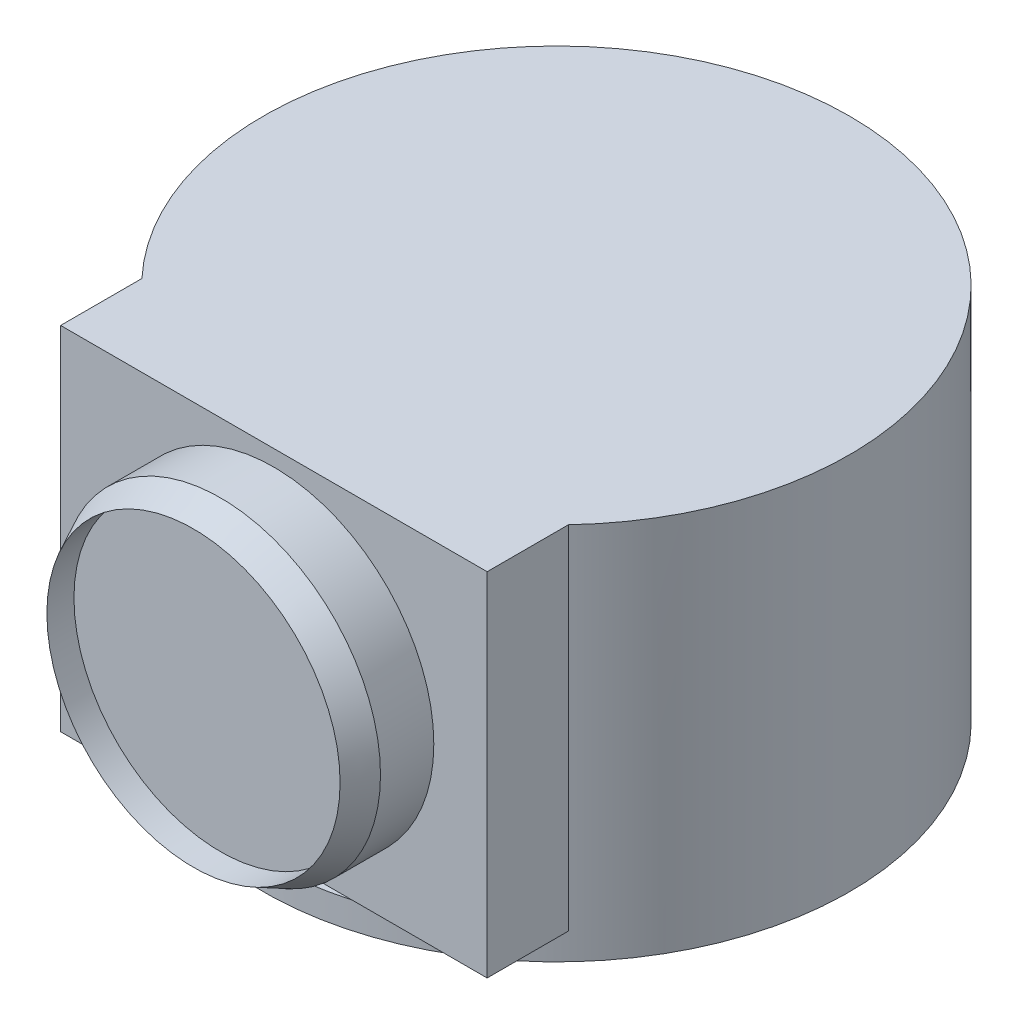
ISO-10303-21;
HEADER;
FILE_DESCRIPTION(('STEP AP214'),'2;1');
FILE_NAME('part.step','',(''),(''),'','','');
FILE_SCHEMA(('AUTOMOTIVE_DESIGN { 1 0 10303 214 1 1 1 1 }'));
ENDSEC;
DATA;
#1=APPLICATION_CONTEXT('core data for automotive mechanical design processes');
#2=APPLICATION_PROTOCOL_DEFINITION('international standard','automotive_design',2000,#1);
#3=PRODUCT_CONTEXT('',#1,'mechanical');
#4=PRODUCT('Part','Part','',(#3));
#5=PRODUCT_RELATED_PRODUCT_CATEGORY('part','',(#4));
#6=PRODUCT_DEFINITION_FORMATION('','',#4);
#7=PRODUCT_DEFINITION_CONTEXT('part definition',#1,'design');
#8=PRODUCT_DEFINITION('design','',#6,#7);
#9=PRODUCT_DEFINITION_SHAPE('','',#8);
#10=(LENGTH_UNIT() NAMED_UNIT(*) SI_UNIT(.MILLI.,.METRE.));
#11=(NAMED_UNIT(*) PLANE_ANGLE_UNIT() SI_UNIT($,.RADIAN.));
#12=(NAMED_UNIT(*) SI_UNIT($,.STERADIAN.) SOLID_ANGLE_UNIT());
#13=UNCERTAINTY_MEASURE_WITH_UNIT(LENGTH_MEASURE(1.E-05),#10,'distance_accuracy_value','');
#14=(GEOMETRIC_REPRESENTATION_CONTEXT(3) GLOBAL_UNCERTAINTY_ASSIGNED_CONTEXT((#13)) GLOBAL_UNIT_ASSIGNED_CONTEXT((#10,
#11,#12)) REPRESENTATION_CONTEXT('',''));
#15=CARTESIAN_POINT('',(0.,0.,0.));
#16=DIRECTION('',(0.,0.,1.));
#17=DIRECTION('',(1.,0.,0.));
#18=AXIS2_PLACEMENT_3D('',#15,#16,#17);
#19=CARTESIAN_POINT('',(0.,0.,0.));
#20=DIRECTION('',(0.,1.,0.));
#21=DIRECTION('',(0.,0.,1.));
#22=AXIS2_PLACEMENT_3D('',#19,#20,#21);
#23=PLANE('',#22);
#24=CARTESIAN_POINT('',(0.,0.,0.));
#25=DIRECTION('',(0.,-1.,0.));
#26=DIRECTION('',(0.,0.,-1.));
#27=AXIS2_PLACEMENT_3D('',#24,#25,#26);
#28=CIRCLE('',#27,55.);
#29=CARTESIAN_POINT('',(40.,0.,37.7491721763537));
#30=VERTEX_POINT('',#29);
#31=CARTESIAN_POINT('',(14.6969384566991,0.,53.));
#32=VERTEX_POINT('',#31);
#33=EDGE_CURVE('E52',#30,#32,#28,.T.);
#34=ORIENTED_EDGE('',*,*,#33,.F.);
#35=DIRECTION('',(0.,0.,-1.));
#36=VECTOR('',#35,1.);
#37=CARTESIAN_POINT('',(40.,0.,63.));
#38=LINE('',#37,#36);
#39=CARTESIAN_POINT('',(40.,0.,53.));
#40=VERTEX_POINT('',#39);
#41=EDGE_CURVE('E94',#40,#30,#38,.T.);
#42=ORIENTED_EDGE('',*,*,#41,.F.);
#43=DIRECTION('',(1.,0.,0.));
#44=VECTOR('',#43,1.);
#45=CARTESIAN_POINT('',(0.,0.,53.));
#46=LINE('',#45,#44);
#47=EDGE_CURVE('E95',#32,#40,#46,.T.);
#48=ORIENTED_EDGE('',*,*,#47,.F.);
#49=EDGE_LOOP('',(#34,#42,#48));
#50=FACE_BOUND('',#49,.T.);
#51=ADVANCED_FACE('F41',(#50),#23,.F.);
#52=CARTESIAN_POINT('',(-14.6969384566991,0.,53.));
#53=VERTEX_POINT('',#52);
#54=CARTESIAN_POINT('',(-40.,0.,37.7491721763537));
#55=VERTEX_POINT('',#54);
#56=EDGE_CURVE('E11',#53,#55,#28,.T.);
#57=ORIENTED_EDGE('',*,*,#56,.F.);
#58=CARTESIAN_POINT('',(-40.,0.,53.));
#59=VERTEX_POINT('',#58);
#60=EDGE_CURVE('E143',#59,#53,#46,.T.);
#61=ORIENTED_EDGE('',*,*,#60,.F.);
#62=DIRECTION('',(0.,0.,-1.));
#63=VECTOR('',#62,1.);
#64=CARTESIAN_POINT('',(-40.,0.,63.));
#65=LINE('',#64,#63);
#66=EDGE_CURVE('E127',#59,#55,#65,.T.);
#67=ORIENTED_EDGE('',*,*,#66,.T.);
#68=EDGE_LOOP('',(#57,#61,#67));
#69=FACE_BOUND('',#68,.T.);
#70=ADVANCED_FACE('F173',(#69),#23,.F.);
#71=CARTESIAN_POINT('',(0.,33.,63.));
#72=DIRECTION('',(0.,0.,-1.));
#73=DIRECTION('',(-1.,0.,0.));
#74=AXIS2_PLACEMENT_3D('',#71,#72,#73);
#75=CYLINDRICAL_SURFACE('',#74,27.5);
#76=CARTESIAN_POINT('',(0.,33.,68.0770407658877));
#77=DIRECTION('',(0.,0.,-1.));
#78=DIRECTION('',(-1.,0.,0.));
#79=AXIS2_PLACEMENT_3D('',#76,#77,#78);
#80=CIRCLE('',#79,27.5);
#81=CARTESIAN_POINT('',(-27.5,33.,68.0770407658877));
#82=VERTEX_POINT('',#81);
#83=EDGE_CURVE('E131',#82,#82,#80,.T.);
#84=ORIENTED_EDGE('',*,*,#83,.F.);
#85=EDGE_LOOP('',(#84));
#86=FACE_BOUND('',#85,.T.);
#87=CARTESIAN_POINT('',(0.,33.,63.));
#88=DIRECTION('',(0.,0.,-1.));
#89=DIRECTION('',(-1.,0.,0.));
#90=AXIS2_PLACEMENT_3D('',#87,#88,#89);
#91=CIRCLE('',#90,27.5);
#92=CARTESIAN_POINT('',(-27.5,33.,63.));
#93=VERTEX_POINT('',#92);
#94=EDGE_CURVE('E135',#93,#93,#91,.T.);
#95=ORIENTED_EDGE('',*,*,#94,.T.);
#96=EDGE_LOOP('',(#95));
#97=FACE_BOUND('',#96,.T.);
#98=ADVANCED_FACE('F177',(#86,#97),#75,.F.);
#99=CARTESIAN_POINT('',(0.,33.,63.));
#100=DIRECTION('',(0.,0.,-1.));
#101=DIRECTION('',(-1.,0.,0.));
#102=AXIS2_PLACEMENT_3D('',#99,#100,#101);
#103=CONICAL_SURFACE('',#102,30.,0.457559469467184);
#104=ORIENTED_EDGE('',*,*,#83,.T.);
#105=EDGE_LOOP('',(#104));
#106=FACE_BOUND('',#105,.T.);
#107=CARTESIAN_POINT('',(0.,33.,63.));
#108=DIRECTION('',(0.,0.,1.));
#109=DIRECTION('',(1.,0.,0.));
#110=AXIS2_PLACEMENT_3D('',#107,#108,#109);
#111=CIRCLE('',#110,30.);
#112=CARTESIAN_POINT('',(30.,33.,63.));
#113=VERTEX_POINT('',#112);
#114=EDGE_CURVE('E148',#113,#113,#111,.T.);
#115=ORIENTED_EDGE('',*,*,#114,.T.);
#116=EDGE_LOOP('',(#115));
#117=FACE_BOUND('',#116,.T.);
#118=ADVANCED_FACE('F189',(#106,#117),#103,.T.);
#119=CARTESIAN_POINT('',(0.,0.,63.));
#120=DIRECTION('',(0.,0.,1.));
#121=DIRECTION('',(1.,0.,0.));
#122=AXIS2_PLACEMENT_3D('',#119,#120,#121);
#123=PLANE('',#122);
#124=ORIENTED_EDGE('',*,*,#94,.F.);
#125=EDGE_LOOP('',(#124));
#126=FACE_BOUND('',#125,.T.);
#127=ADVANCED_FACE('F186',(#126),#123,.T.);
#128=CARTESIAN_POINT('',(0.,33.,53.));
#129=DIRECTION('',(0.,0.,1.));
#130=DIRECTION('',(1.,0.,0.));
#131=AXIS2_PLACEMENT_3D('',#128,#129,#130);
#132=PLANE('',#131);
#133=DIRECTION('',(1.,0.,0.));
#134=VECTOR('',#133,1.);
#135=CARTESIAN_POINT('',(0.,66.,53.));
#136=LINE('',#135,#134);
#137=CARTESIAN_POINT('',(-40.,66.,53.));
#138=VERTEX_POINT('',#137);
#139=CARTESIAN_POINT('',(40.,66.,53.));
#140=VERTEX_POINT('',#139);
#141=EDGE_CURVE('E60',#138,#140,#136,.T.);
#142=ORIENTED_EDGE('',*,*,#141,.F.);
#143=DIRECTION('',(0.,1.,0.));
#144=VECTOR('',#143,1.);
#145=CARTESIAN_POINT('',(-40.,0.,53.));
#146=LINE('',#145,#144);
#147=EDGE_CURVE('E45',#59,#138,#146,.T.);
#148=ORIENTED_EDGE('',*,*,#147,.F.);
#149=ORIENTED_EDGE('',*,*,#60,.T.);
#150=EDGE_CURVE('E147',#53,#32,#46,.T.);
#151=ORIENTED_EDGE('',*,*,#150,.T.);
#152=ORIENTED_EDGE('',*,*,#47,.T.);
#153=DIRECTION('',(0.,-1.,0.));
#154=VECTOR('',#153,1.);
#155=CARTESIAN_POINT('',(40.,0.,53.));
#156=LINE('',#155,#154);
#157=EDGE_CURVE('E109',#140,#40,#156,.T.);
#158=ORIENTED_EDGE('',*,*,#157,.F.);
#159=EDGE_LOOP('',(#142,#148,#149,#151,#152,#158));
#160=FACE_BOUND('',#159,.T.);
#161=CARTESIAN_POINT('',(0.,33.,53.));
#162=DIRECTION('',(0.,0.,1.));
#163=DIRECTION('',(1.,0.,0.));
#164=AXIS2_PLACEMENT_3D('',#161,#162,#163);
#165=CIRCLE('',#164,30.);
#166=CARTESIAN_POINT('',(30.,33.,53.));
#167=VERTEX_POINT('',#166);
#168=EDGE_CURVE('E152',#167,#167,#165,.T.);
#169=ORIENTED_EDGE('',*,*,#168,.F.);
#170=EDGE_LOOP('',(#169));
#171=FACE_BOUND('',#170,.T.);
#172=ADVANCED_FACE('F169',(#160,#171),#132,.T.);
#173=CARTESIAN_POINT('',(0.,33.,53.));
#174=DIRECTION('',(0.,0.,1.));
#175=DIRECTION('',(1.,0.,0.));
#176=AXIS2_PLACEMENT_3D('',#173,#174,#175);
#177=CYLINDRICAL_SURFACE('',#176,30.);
#178=ORIENTED_EDGE('',*,*,#168,.T.);
#179=EDGE_LOOP('',(#178));
#180=FACE_BOUND('',#179,.T.);
#181=ORIENTED_EDGE('',*,*,#114,.F.);
#182=EDGE_LOOP('',(#181));
#183=FACE_BOUND('',#182,.T.);
#184=ADVANCED_FACE('F162',(#180,#183),#177,.T.);
#185=CARTESIAN_POINT('',(0.,66.,0.));
#186=DIRECTION('',(0.,-1.,0.));
#187=DIRECTION('',(0.,0.,-1.));
#188=AXIS2_PLACEMENT_3D('',#185,#186,#187);
#189=CYLINDRICAL_SURFACE('',#188,55.);
#190=CARTESIAN_POINT('',(0.,66.,0.));
#191=DIRECTION('',(0.,1.,0.));
#192=DIRECTION('',(0.,0.,1.));
#193=AXIS2_PLACEMENT_3D('',#190,#191,#192);
#194=CIRCLE('',#193,55.);
#195=CARTESIAN_POINT('',(40.,66.,37.7491721763538));
#196=VERTEX_POINT('',#195);
#197=CARTESIAN_POINT('',(-40.,66.,37.7491721763537));
#198=VERTEX_POINT('',#197);
#199=EDGE_CURVE('E116',#196,#198,#194,.T.);
#200=ORIENTED_EDGE('',*,*,#199,.F.);
#201=DIRECTION('',(0.,-1.,0.));
#202=VECTOR('',#201,1.);
#203=CARTESIAN_POINT('',(40.,66.,37.7491721763538));
#204=LINE('',#203,#202);
#205=EDGE_CURVE('E107',#196,#30,#204,.T.);
#206=ORIENTED_EDGE('',*,*,#205,.T.);
#207=ORIENTED_EDGE('',*,*,#33,.T.);
#208=EDGE_CURVE('E53',#32,#53,#28,.T.);
#209=ORIENTED_EDGE('',*,*,#208,.T.);
#210=ORIENTED_EDGE('',*,*,#56,.T.);
#211=DIRECTION('',(0.,-1.,0.));
#212=VECTOR('',#211,1.);
#213=CARTESIAN_POINT('',(-40.,66.,37.7491721763537));
#214=LINE('',#213,#212);
#215=EDGE_CURVE('E111',#55,#198,#214,.F.);
#216=ORIENTED_EDGE('',*,*,#215,.T.);
#217=EDGE_LOOP('',(#200,#206,#207,#209,#210,#216));
#218=FACE_BOUND('',#217,.T.);
#219=CARTESIAN_POINT('',(0.,-5.,0.));
#220=DIRECTION('',(0.,-1.,0.));
#221=DIRECTION('',(0.,0.,-1.));
#222=AXIS2_PLACEMENT_3D('',#219,#220,#221);
#223=CIRCLE('',#222,55.);
#224=CARTESIAN_POINT('',(0.,-5.,-55.));
#225=VERTEX_POINT('',#224);
#226=EDGE_CURVE('E101',#225,#225,#223,.T.);
#227=ORIENTED_EDGE('',*,*,#226,.F.);
#228=EDGE_LOOP('',(#227));
#229=FACE_BOUND('',#228,.T.);
#230=ADVANCED_FACE('F43',(#218,#229),#189,.T.);
#231=CARTESIAN_POINT('',(40.,0.,63.));
#232=DIRECTION('',(1.,0.,0.));
#233=DIRECTION('',(0.,1.,0.));
#234=AXIS2_PLACEMENT_3D('',#231,#232,#233);
#235=PLANE('',#234);
#236=DIRECTION('',(0.,0.,-1.));
#237=VECTOR('',#236,1.);
#238=CARTESIAN_POINT('',(40.,66.,63.));
#239=LINE('',#238,#237);
#240=EDGE_CURVE('E112',#140,#196,#239,.T.);
#241=ORIENTED_EDGE('',*,*,#240,.F.);
#242=ORIENTED_EDGE('',*,*,#157,.T.);
#243=ORIENTED_EDGE('',*,*,#41,.T.);
#244=ORIENTED_EDGE('',*,*,#205,.F.);
#245=EDGE_LOOP('',(#241,#242,#243,#244));
#246=FACE_BOUND('',#245,.T.);
#247=ADVANCED_FACE('F106',(#246),#235,.T.);
#248=CARTESIAN_POINT('',(-40.,0.,63.));
#249=DIRECTION('',(-1.,0.,0.));
#250=DIRECTION('',(0.,0.,1.));
#251=AXIS2_PLACEMENT_3D('',#248,#249,#250);
#252=PLANE('',#251);
#253=ORIENTED_EDGE('',*,*,#66,.F.);
#254=ORIENTED_EDGE('',*,*,#147,.T.);
#255=DIRECTION('',(0.,0.,-1.));
#256=VECTOR('',#255,1.);
#257=CARTESIAN_POINT('',(-40.,66.,63.));
#258=LINE('',#257,#256);
#259=EDGE_CURVE('E67',#138,#198,#258,.T.);
#260=ORIENTED_EDGE('',*,*,#259,.T.);
#261=ORIENTED_EDGE('',*,*,#215,.F.);
#262=EDGE_LOOP('',(#253,#254,#260,#261));
#263=FACE_BOUND('',#262,.T.);
#264=ADVANCED_FACE('F167',(#263),#252,.T.);
#265=CARTESIAN_POINT('',(0.,66.,0.));
#266=DIRECTION('',(0.,1.,0.));
#267=DIRECTION('',(0.,0.,1.));
#268=AXIS2_PLACEMENT_3D('',#265,#266,#267);
#269=PLANE('',#268);
#270=ORIENTED_EDGE('',*,*,#259,.F.);
#271=ORIENTED_EDGE('',*,*,#141,.T.);
#272=ORIENTED_EDGE('',*,*,#240,.T.);
#273=ORIENTED_EDGE('',*,*,#199,.T.);
#274=EDGE_LOOP('',(#270,#271,#272,#273));
#275=FACE_BOUND('',#274,.T.);
#276=ADVANCED_FACE('F180',(#275),#269,.T.);
#277=CARTESIAN_POINT('',(0.,-5.,0.));
#278=DIRECTION('',(0.,-1.,0.));
#279=DIRECTION('',(0.,0.,-1.));
#280=AXIS2_PLACEMENT_3D('',#277,#278,#279);
#281=PLANE('',#280);
#282=ORIENTED_EDGE('',*,*,#226,.T.);
#283=EDGE_LOOP('',(#282));
#284=FACE_BOUND('',#283,.T.);
#285=ADVANCED_FACE('F160',(#284),#281,.T.);
#286=CARTESIAN_POINT('',(0.,0.,0.));
#287=DIRECTION('',(0.,-1.,0.));
#288=DIRECTION('',(0.,0.,-1.));
#289=AXIS2_PLACEMENT_3D('',#286,#287,#288);
#290=PLANE('',#289);
#291=ORIENTED_EDGE('',*,*,#150,.F.);
#292=ORIENTED_EDGE('',*,*,#208,.F.);
#293=EDGE_LOOP('',(#291,#292));
#294=FACE_BOUND('',#293,.T.);
#295=ADVANCED_FACE('F199',(#294),#290,.F.);
#296=CLOSED_SHELL('',(#51,#70,#98,#118,#127,#172,#184,#230,#247,#264,#276,#285,#295));
#297=MANIFOLD_SOLID_BREP('B2',#296);
#298=ADVANCED_BREP_SHAPE_REPRESENTATION('',(#18,#297),#14);
#299=SHAPE_DEFINITION_REPRESENTATION(#9,#298);
ENDSEC;
END-ISO-10303-21;
